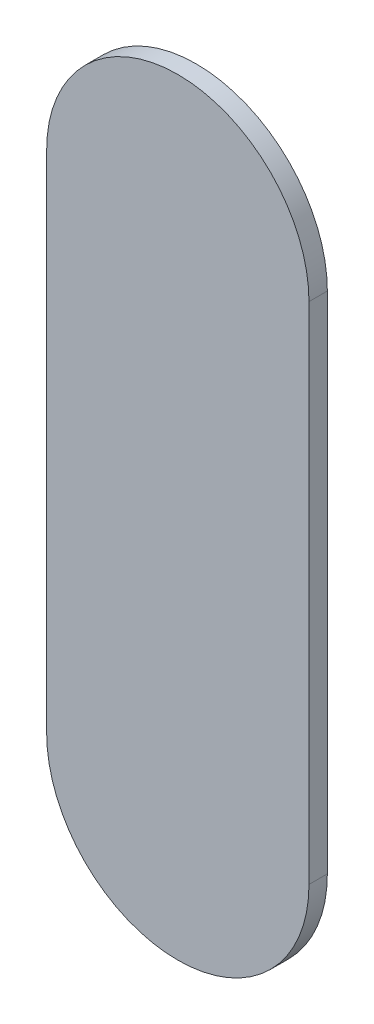
ISO-10303-21;
HEADER;
FILE_DESCRIPTION(('STEP AP214'),'2;1');
FILE_NAME('part.step','',(''),(''),'','','');
FILE_SCHEMA(('AUTOMOTIVE_DESIGN { 1 0 10303 214 1 1 1 1 }'));
ENDSEC;
DATA;
#1=APPLICATION_CONTEXT('core data for automotive mechanical design processes');
#2=APPLICATION_PROTOCOL_DEFINITION('international standard','automotive_design',2000,#1);
#3=PRODUCT_CONTEXT('',#1,'mechanical');
#4=PRODUCT('Part','Part','',(#3));
#5=PRODUCT_RELATED_PRODUCT_CATEGORY('part','',(#4));
#6=PRODUCT_DEFINITION_FORMATION('','',#4);
#7=PRODUCT_DEFINITION_CONTEXT('part definition',#1,'design');
#8=PRODUCT_DEFINITION('design','',#6,#7);
#9=PRODUCT_DEFINITION_SHAPE('','',#8);
#10=(LENGTH_UNIT() NAMED_UNIT(*) SI_UNIT(.MILLI.,.METRE.));
#11=(NAMED_UNIT(*) PLANE_ANGLE_UNIT() SI_UNIT($,.RADIAN.));
#12=(NAMED_UNIT(*) SI_UNIT($,.STERADIAN.) SOLID_ANGLE_UNIT());
#13=UNCERTAINTY_MEASURE_WITH_UNIT(LENGTH_MEASURE(1.E-05),#10,'distance_accuracy_value','');
#14=(GEOMETRIC_REPRESENTATION_CONTEXT(3) GLOBAL_UNCERTAINTY_ASSIGNED_CONTEXT((#13)) GLOBAL_UNIT_ASSIGNED_CONTEXT((#10,
#11,#12)) REPRESENTATION_CONTEXT('',''));
#15=CARTESIAN_POINT('',(0.,0.,0.));
#16=DIRECTION('',(0.,0.,1.));
#17=DIRECTION('',(1.,0.,0.));
#18=AXIS2_PLACEMENT_3D('',#15,#16,#17);
#19=CARTESIAN_POINT('',(129.505,-109.327,1.635));
#20=DIRECTION('',(0.,0.,1.));
#21=DIRECTION('',(1.,0.,0.));
#22=AXIS2_PLACEMENT_3D('',#19,#20,#21);
#23=PLANE('',#22);
#24=DIRECTION('',(0.,-1.,0.));
#25=VECTOR('',#24,1.);
#26=CARTESIAN_POINT('',(129.505,-109.327,1.635));
#27=LINE('',#26,#25);
#28=CARTESIAN_POINT('',(129.505,-109.327,1.635));
#29=VERTEX_POINT('',#28);
#30=CARTESIAN_POINT('',(129.505,-110.289,1.635));
#31=VERTEX_POINT('',#30);
#32=EDGE_CURVE('E97',#29,#31,#27,.T.);
#33=ORIENTED_EDGE('',*,*,#32,.T.);
#34=CARTESIAN_POINT('',(129.755,-110.289,1.635));
#35=DIRECTION('',(0.,0.,1.));
#36=DIRECTION('',(-1.,0.,0.));
#37=AXIS2_PLACEMENT_3D('',#34,#35,#36);
#38=CIRCLE('',#37,0.25);
#39=CARTESIAN_POINT('',(130.005,-110.289,1.635));
#40=VERTEX_POINT('',#39);
#41=EDGE_CURVE('E76',#31,#40,#38,.T.);
#42=ORIENTED_EDGE('',*,*,#41,.T.);
#43=DIRECTION('',(0.,1.,0.));
#44=VECTOR('',#43,1.);
#45=CARTESIAN_POINT('',(130.005,-110.289,1.635));
#46=LINE('',#45,#44);
#47=CARTESIAN_POINT('',(130.005,-109.327,1.635));
#48=VERTEX_POINT('',#47);
#49=EDGE_CURVE('E81',#40,#48,#46,.T.);
#50=ORIENTED_EDGE('',*,*,#49,.T.);
#51=CARTESIAN_POINT('',(129.755,-109.327,1.635));
#52=DIRECTION('',(0.,0.,1.));
#53=DIRECTION('',(1.,0.,0.));
#54=AXIS2_PLACEMENT_3D('',#51,#52,#53);
#55=CIRCLE('',#54,0.25);
#56=EDGE_CURVE('E11',#48,#29,#55,.T.);
#57=ORIENTED_EDGE('',*,*,#56,.T.);
#58=EDGE_LOOP('',(#33,#42,#50,#57));
#59=FACE_BOUND('',#58,.T.);
#60=ADVANCED_FACE('F17',(#59),#23,.T.);
#61=CARTESIAN_POINT('',(129.505,-109.327,1.6));
#62=DIRECTION('',(0.,0.,1.));
#63=DIRECTION('',(1.,0.,0.));
#64=AXIS2_PLACEMENT_3D('',#61,#62,#63);
#65=PLANE('',#64);
#66=CARTESIAN_POINT('',(129.755,-109.327,1.6));
#67=DIRECTION('',(0.,0.,1.));
#68=DIRECTION('',(1.,0.,0.));
#69=AXIS2_PLACEMENT_3D('',#66,#67,#68);
#70=CIRCLE('',#69,0.25);
#71=CARTESIAN_POINT('',(130.005,-109.327,1.6));
#72=VERTEX_POINT('',#71);
#73=CARTESIAN_POINT('',(129.505,-109.327,1.6));
#74=VERTEX_POINT('',#73);
#75=EDGE_CURVE('E25',#72,#74,#70,.T.);
#76=ORIENTED_EDGE('',*,*,#75,.F.);
#77=DIRECTION('',(0.,1.,0.));
#78=VECTOR('',#77,1.);
#79=CARTESIAN_POINT('',(130.005,-110.289,1.6));
#80=LINE('',#79,#78);
#81=CARTESIAN_POINT('',(130.005,-110.289,1.6));
#82=VERTEX_POINT('',#81);
#83=EDGE_CURVE('E66',#82,#72,#80,.T.);
#84=ORIENTED_EDGE('',*,*,#83,.F.);
#85=CARTESIAN_POINT('',(129.755,-110.289,1.6));
#86=DIRECTION('',(0.,0.,1.));
#87=DIRECTION('',(-1.,0.,0.));
#88=AXIS2_PLACEMENT_3D('',#85,#86,#87);
#89=CIRCLE('',#88,0.25);
#90=CARTESIAN_POINT('',(129.505,-110.289,1.6));
#91=VERTEX_POINT('',#90);
#92=EDGE_CURVE('E70',#91,#82,#89,.T.);
#93=ORIENTED_EDGE('',*,*,#92,.F.);
#94=DIRECTION('',(0.,-1.,0.));
#95=VECTOR('',#94,1.);
#96=CARTESIAN_POINT('',(129.505,-109.327,1.6));
#97=LINE('',#96,#95);
#98=EDGE_CURVE('E100',#74,#91,#97,.T.);
#99=ORIENTED_EDGE('',*,*,#98,.F.);
#100=EDGE_LOOP('',(#76,#84,#93,#99));
#101=FACE_BOUND('',#100,.T.);
#102=ADVANCED_FACE('F68',(#101),#65,.F.);
#103=CARTESIAN_POINT('',(129.755,-109.327,1.6));
#104=DIRECTION('',(0.,0.,-1.));
#105=DIRECTION('',(1.,0.,0.));
#106=AXIS2_PLACEMENT_3D('',#103,#104,#105);
#107=CYLINDRICAL_SURFACE('',#106,0.25);
#108=ORIENTED_EDGE('',*,*,#75,.T.);
#109=DIRECTION('',(0.,0.,1.));
#110=VECTOR('',#109,1.);
#111=CARTESIAN_POINT('',(129.505,-109.327,1.6));
#112=LINE('',#111,#110);
#113=EDGE_CURVE('E91',#74,#29,#112,.T.);
#114=ORIENTED_EDGE('',*,*,#113,.T.);
#115=ORIENTED_EDGE('',*,*,#56,.F.);
#116=DIRECTION('',(0.,0.,1.));
#117=VECTOR('',#116,1.);
#118=CARTESIAN_POINT('',(130.005,-109.327,1.6));
#119=LINE('',#118,#117);
#120=EDGE_CURVE('E75',#72,#48,#119,.T.);
#121=ORIENTED_EDGE('',*,*,#120,.F.);
#122=EDGE_LOOP('',(#108,#114,#115,#121));
#123=FACE_BOUND('',#122,.T.);
#124=ADVANCED_FACE('F117',(#123),#107,.T.);
#125=CARTESIAN_POINT('',(130.005,-110.289,1.6));
#126=DIRECTION('',(-1.,0.,0.));
#127=DIRECTION('',(0.,0.,1.));
#128=AXIS2_PLACEMENT_3D('',#125,#126,#127);
#129=PLANE('',#128);
#130=ORIENTED_EDGE('',*,*,#83,.T.);
#131=ORIENTED_EDGE('',*,*,#120,.T.);
#132=ORIENTED_EDGE('',*,*,#49,.F.);
#133=DIRECTION('',(0.,0.,1.));
#134=VECTOR('',#133,1.);
#135=CARTESIAN_POINT('',(130.005,-110.289,1.6));
#136=LINE('',#135,#134);
#137=EDGE_CURVE('E79',#82,#40,#136,.T.);
#138=ORIENTED_EDGE('',*,*,#137,.F.);
#139=EDGE_LOOP('',(#130,#131,#132,#138));
#140=FACE_BOUND('',#139,.T.);
#141=ADVANCED_FACE('F80',(#140),#129,.F.);
#142=CARTESIAN_POINT('',(129.755,-110.289,1.6));
#143=DIRECTION('',(0.,0.,-1.));
#144=DIRECTION('',(-1.,0.,0.));
#145=AXIS2_PLACEMENT_3D('',#142,#143,#144);
#146=CYLINDRICAL_SURFACE('',#145,0.25);
#147=ORIENTED_EDGE('',*,*,#92,.T.);
#148=ORIENTED_EDGE('',*,*,#137,.T.);
#149=ORIENTED_EDGE('',*,*,#41,.F.);
#150=DIRECTION('',(0.,0.,1.));
#151=VECTOR('',#150,1.);
#152=CARTESIAN_POINT('',(129.505,-110.289,1.6));
#153=LINE('',#152,#151);
#154=EDGE_CURVE('E88',#91,#31,#153,.T.);
#155=ORIENTED_EDGE('',*,*,#154,.F.);
#156=EDGE_LOOP('',(#147,#148,#149,#155));
#157=FACE_BOUND('',#156,.T.);
#158=ADVANCED_FACE('F86',(#157),#146,.T.);
#159=CARTESIAN_POINT('',(129.505,-109.327,1.6));
#160=DIRECTION('',(1.,0.,0.));
#161=DIRECTION('',(0.,1.,0.));
#162=AXIS2_PLACEMENT_3D('',#159,#160,#161);
#163=PLANE('',#162);
#164=ORIENTED_EDGE('',*,*,#98,.T.);
#165=ORIENTED_EDGE('',*,*,#154,.T.);
#166=ORIENTED_EDGE('',*,*,#32,.F.);
#167=ORIENTED_EDGE('',*,*,#113,.F.);
#168=EDGE_LOOP('',(#164,#165,#166,#167));
#169=FACE_BOUND('',#168,.T.);
#170=ADVANCED_FACE('F121',(#169),#163,.F.);
#171=CLOSED_SHELL('',(#60,#102,#124,#141,#158,#170));
#172=MANIFOLD_SOLID_BREP('B1',#171);
#173=ADVANCED_BREP_SHAPE_REPRESENTATION('',(#18,#172),#14);
#174=SHAPE_DEFINITION_REPRESENTATION(#9,#173);
ENDSEC;
END-ISO-10303-21;
